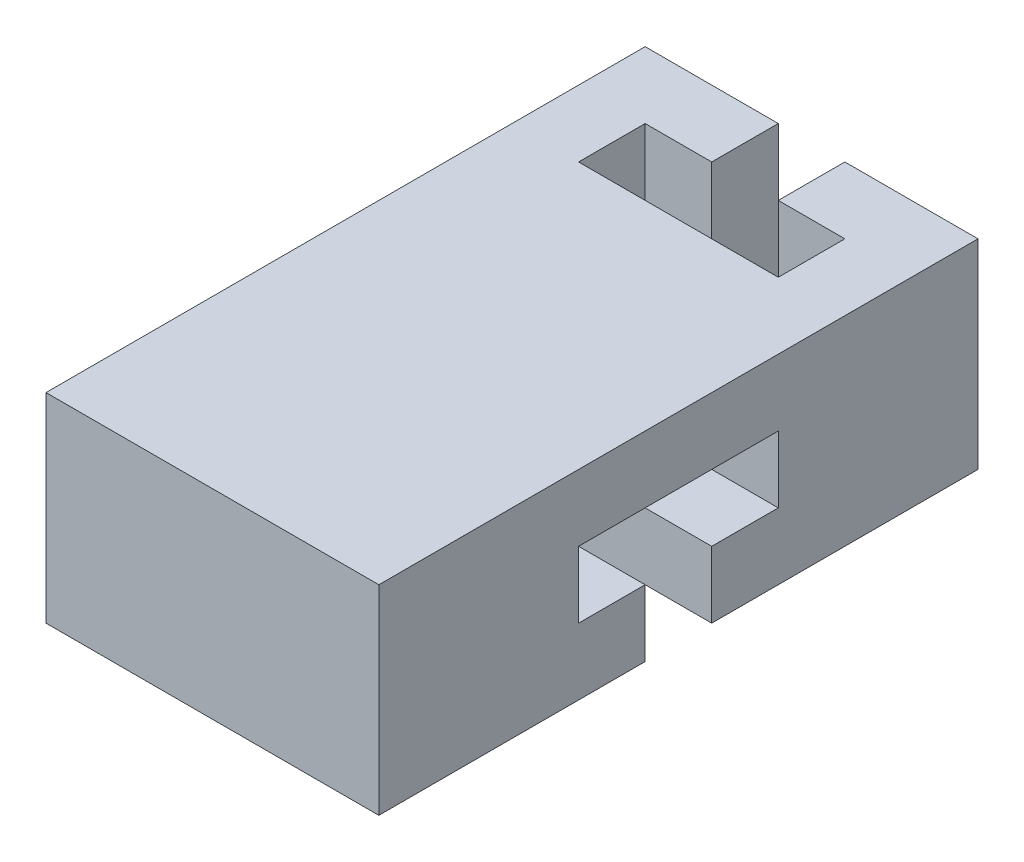
ISO-10303-21;
HEADER;
FILE_DESCRIPTION(('STEP AP214'),'2;1');
FILE_NAME('part.step','',(''),(''),'','','');
FILE_SCHEMA(('AUTOMOTIVE_DESIGN { 1 0 10303 214 1 1 1 1 }'));
ENDSEC;
DATA;
#1=APPLICATION_CONTEXT('core data for automotive mechanical design processes');
#2=APPLICATION_PROTOCOL_DEFINITION('international standard','automotive_design',2000,#1);
#3=PRODUCT_CONTEXT('',#1,'mechanical');
#4=PRODUCT('Part','Part','',(#3));
#5=PRODUCT_RELATED_PRODUCT_CATEGORY('part','',(#4));
#6=PRODUCT_DEFINITION_FORMATION('','',#4);
#7=PRODUCT_DEFINITION_CONTEXT('part definition',#1,'design');
#8=PRODUCT_DEFINITION('design','',#6,#7);
#9=PRODUCT_DEFINITION_SHAPE('','',#8);
#10=(LENGTH_UNIT() NAMED_UNIT(*) SI_UNIT(.MILLI.,.METRE.));
#11=(NAMED_UNIT(*) PLANE_ANGLE_UNIT() SI_UNIT($,.RADIAN.));
#12=(NAMED_UNIT(*) SI_UNIT($,.STERADIAN.) SOLID_ANGLE_UNIT());
#13=UNCERTAINTY_MEASURE_WITH_UNIT(LENGTH_MEASURE(1.E-05),#10,'distance_accuracy_value','');
#14=(GEOMETRIC_REPRESENTATION_CONTEXT(3) GLOBAL_UNCERTAINTY_ASSIGNED_CONTEXT((#13)) GLOBAL_UNIT_ASSIGNED_CONTEXT((#10,
#11,#12)) REPRESENTATION_CONTEXT('',''));
#15=CARTESIAN_POINT('',(0.,0.,0.));
#16=DIRECTION('',(0.,0.,1.));
#17=DIRECTION('',(1.,0.,0.));
#18=AXIS2_PLACEMENT_3D('',#15,#16,#17);
#19=CARTESIAN_POINT('',(-250.,75.,-225.));
#20=DIRECTION('',(0.,0.,-1.));
#21=DIRECTION('',(0.,1.,0.));
#22=AXIS2_PLACEMENT_3D('',#19,#20,#21);
#23=PLANE('',#22);
#24=DIRECTION('',(0.,-1.,0.));
#25=VECTOR('',#24,1.);
#26=CARTESIAN_POINT('',(-100.,75.,-225.));
#27=LINE('',#26,#25);
#28=CARTESIAN_POINT('',(-100.,75.,-225.));
#29=VERTEX_POINT('',#28);
#30=CARTESIAN_POINT('',(-100.,-75.,-225.));
#31=VERTEX_POINT('',#30);
#32=EDGE_CURVE('E11',#29,#31,#27,.T.);
#33=ORIENTED_EDGE('',*,*,#32,.F.);
#34=DIRECTION('',(1.,0.,0.));
#35=VECTOR('',#34,1.);
#36=CARTESIAN_POINT('',(-250.,75.,-225.));
#37=LINE('',#36,#35);
#38=CARTESIAN_POINT('',(0.,75.,-225.));
#39=VERTEX_POINT('',#38);
#40=EDGE_CURVE('E222',#29,#39,#37,.T.);
#41=ORIENTED_EDGE('',*,*,#40,.T.);
#42=DIRECTION('',(0.,1.,0.));
#43=VECTOR('',#42,1.);
#44=CARTESIAN_POINT('',(0.,75.,-225.));
#45=LINE('',#44,#43);
#46=CARTESIAN_POINT('',(0.,-75.,-225.));
#47=VERTEX_POINT('',#46);
#48=EDGE_CURVE('E172',#47,#39,#45,.T.);
#49=ORIENTED_EDGE('',*,*,#48,.F.);
#50=DIRECTION('',(1.,0.,0.));
#51=VECTOR('',#50,1.);
#52=CARTESIAN_POINT('',(-250.,-75.,-225.));
#53=LINE('',#52,#51);
#54=EDGE_CURVE('E168',#31,#47,#53,.T.);
#55=ORIENTED_EDGE('',*,*,#54,.F.);
#56=EDGE_LOOP('',(#33,#41,#49,#55));
#57=FACE_BOUND('',#56,.T.);
#58=ADVANCED_FACE('F32',(#57),#23,.T.);
#59=CARTESIAN_POINT('',(-250.,-75.,-25.));
#60=DIRECTION('',(0.,-1.,0.));
#61=DIRECTION('',(0.,0.,-1.));
#62=AXIS2_PLACEMENT_3D('',#59,#60,#61);
#63=PLANE('',#62);
#64=DIRECTION('',(0.,0.,1.));
#65=VECTOR('',#64,1.);
#66=CARTESIAN_POINT('',(-100.,-75.,-24.9999999999999));
#67=LINE('',#66,#65);
#68=CARTESIAN_POINT('',(-100.,-75.,-175.));
#69=VERTEX_POINT('',#68);
#70=EDGE_CURVE('E301',#31,#69,#67,.T.);
#71=ORIENTED_EDGE('',*,*,#70,.F.);
#72=ORIENTED_EDGE('',*,*,#54,.T.);
#73=DIRECTION('',(0.,0.,-1.));
#74=VECTOR('',#73,1.);
#75=CARTESIAN_POINT('',(0.,-75.,-25.));
#76=LINE('',#75,#74);
#77=CARTESIAN_POINT('',(0.,-75.,-25.));
#78=VERTEX_POINT('',#77);
#79=EDGE_CURVE('E169',#78,#47,#76,.T.);
#80=ORIENTED_EDGE('',*,*,#79,.F.);
#81=DIRECTION('',(1.,0.,0.));
#82=VECTOR('',#81,1.);
#83=CARTESIAN_POINT('',(-250.,-75.,-25.));
#84=LINE('',#83,#82);
#85=CARTESIAN_POINT('',(-250.,-75.,-25.));
#86=VERTEX_POINT('',#85);
#87=EDGE_CURVE('E56',#86,#78,#84,.T.);
#88=ORIENTED_EDGE('',*,*,#87,.F.);
#89=DIRECTION('',(0.,0.,-1.));
#90=VECTOR('',#89,1.);
#91=CARTESIAN_POINT('',(-250.,-75.,-25.));
#92=LINE('',#91,#90);
#93=CARTESIAN_POINT('',(-250.,-75.,-225.));
#94=VERTEX_POINT('',#93);
#95=EDGE_CURVE('E203',#86,#94,#92,.T.);
#96=ORIENTED_EDGE('',*,*,#95,.T.);
#97=CARTESIAN_POINT('',(-150.,-75.,-225.));
#98=VERTEX_POINT('',#97);
#99=EDGE_CURVE('E107',#94,#98,#53,.T.);
#100=ORIENTED_EDGE('',*,*,#99,.T.);
#101=DIRECTION('',(0.,0.,-1.));
#102=VECTOR('',#101,1.);
#103=CARTESIAN_POINT('',(-150.,-75.,-25.));
#104=LINE('',#103,#102);
#105=CARTESIAN_POINT('',(-150.,-75.,-175.));
#106=VERTEX_POINT('',#105);
#107=EDGE_CURVE('E47',#106,#98,#104,.T.);
#108=ORIENTED_EDGE('',*,*,#107,.F.);
#109=DIRECTION('',(1.,0.,0.));
#110=VECTOR('',#109,1.);
#111=CARTESIAN_POINT('',(-250.,-75.,-175.));
#112=LINE('',#111,#110);
#113=CARTESIAN_POINT('',(-200.,-75.,-175.));
#114=VERTEX_POINT('',#113);
#115=EDGE_CURVE('E309',#114,#106,#112,.T.);
#116=ORIENTED_EDGE('',*,*,#115,.F.);
#117=DIRECTION('',(0.,0.,-1.));
#118=VECTOR('',#117,1.);
#119=CARTESIAN_POINT('',(-200.,-75.,-25.));
#120=LINE('',#119,#118);
#121=CARTESIAN_POINT('',(-200.,-75.,-125.));
#122=VERTEX_POINT('',#121);
#123=EDGE_CURVE('E312',#122,#114,#120,.T.);
#124=ORIENTED_EDGE('',*,*,#123,.F.);
#125=DIRECTION('',(-1.,0.,0.));
#126=VECTOR('',#125,1.);
#127=CARTESIAN_POINT('',(-250.,-75.,-125.));
#128=LINE('',#127,#126);
#129=CARTESIAN_POINT('',(-50.,-75.,-125.));
#130=VERTEX_POINT('',#129);
#131=EDGE_CURVE('E320',#130,#122,#128,.T.);
#132=ORIENTED_EDGE('',*,*,#131,.F.);
#133=DIRECTION('',(0.,0.,1.));
#134=VECTOR('',#133,1.);
#135=CARTESIAN_POINT('',(-50.,-75.,-25.));
#136=LINE('',#135,#134);
#137=CARTESIAN_POINT('',(-50.,-75.,-175.));
#138=VERTEX_POINT('',#137);
#139=EDGE_CURVE('E323',#138,#130,#136,.T.);
#140=ORIENTED_EDGE('',*,*,#139,.F.);
#141=DIRECTION('',(1.,0.,0.));
#142=VECTOR('',#141,1.);
#143=CARTESIAN_POINT('',(-250.,-75.,-175.));
#144=LINE('',#143,#142);
#145=EDGE_CURVE('E173',#69,#138,#144,.T.);
#146=ORIENTED_EDGE('',*,*,#145,.F.);
#147=EDGE_LOOP('',(#71,#72,#80,#88,#96,#100,#108,#116,#124,#132,#140,#146));
#148=FACE_BOUND('',#147,.T.);
#149=ADVANCED_FACE('F34',(#148),#63,.T.);
#150=CARTESIAN_POINT('',(-250.,-25.,-25.));
#151=DIRECTION('',(0.,0.,1.));
#152=DIRECTION('',(0.,-1.,0.));
#153=AXIS2_PLACEMENT_3D('',#150,#151,#152);
#154=PLANE('',#153);
#155=DIRECTION('',(0.,-1.,0.));
#156=VECTOR('',#155,1.);
#157=CARTESIAN_POINT('',(0.,-25.,-25.));
#158=LINE('',#157,#156);
#159=CARTESIAN_POINT('',(0.,-25.,-25.));
#160=VERTEX_POINT('',#159);
#161=EDGE_CURVE('E200',#160,#78,#158,.T.);
#162=ORIENTED_EDGE('',*,*,#161,.F.);
#163=DIRECTION('',(1.,0.,0.));
#164=VECTOR('',#163,1.);
#165=CARTESIAN_POINT('',(-250.,-25.,-25.));
#166=LINE('',#165,#164);
#167=CARTESIAN_POINT('',(-250.,-25.,-25.));
#168=VERTEX_POINT('',#167);
#169=EDGE_CURVE('E149',#168,#160,#166,.T.);
#170=ORIENTED_EDGE('',*,*,#169,.F.);
#171=DIRECTION('',(0.,-1.,0.));
#172=VECTOR('',#171,1.);
#173=CARTESIAN_POINT('',(-250.,-25.,-25.));
#174=LINE('',#173,#172);
#175=EDGE_CURVE('E158',#168,#86,#174,.T.);
#176=ORIENTED_EDGE('',*,*,#175,.T.);
#177=ORIENTED_EDGE('',*,*,#87,.T.);
#178=EDGE_LOOP('',(#162,#170,#176,#177));
#179=FACE_BOUND('',#178,.T.);
#180=ADVANCED_FACE('F383',(#179),#154,.T.);
#181=CARTESIAN_POINT('',(-250.,-25.,-75.));
#182=DIRECTION('',(0.,1.,0.));
#183=DIRECTION('',(0.,0.,1.));
#184=AXIS2_PLACEMENT_3D('',#181,#182,#183);
#185=PLANE('',#184);
#186=DIRECTION('',(0.,0.,1.));
#187=VECTOR('',#186,1.);
#188=CARTESIAN_POINT('',(0.,-25.,-75.));
#189=LINE('',#188,#187);
#190=CARTESIAN_POINT('',(0.,-25.,-75.));
#191=VERTEX_POINT('',#190);
#192=EDGE_CURVE('E144',#191,#160,#189,.T.);
#193=ORIENTED_EDGE('',*,*,#192,.F.);
#194=DIRECTION('',(1.,0.,0.));
#195=VECTOR('',#194,1.);
#196=CARTESIAN_POINT('',(-250.,-25.,-75.));
#197=LINE('',#196,#195);
#198=CARTESIAN_POINT('',(-250.,-25.,-75.));
#199=VERTEX_POINT('',#198);
#200=EDGE_CURVE('E138',#199,#191,#197,.T.);
#201=ORIENTED_EDGE('',*,*,#200,.F.);
#202=DIRECTION('',(0.,0.,1.));
#203=VECTOR('',#202,1.);
#204=CARTESIAN_POINT('',(-250.,-25.,-75.));
#205=LINE('',#204,#203);
#206=EDGE_CURVE('E141',#199,#168,#205,.T.);
#207=ORIENTED_EDGE('',*,*,#206,.T.);
#208=ORIENTED_EDGE('',*,*,#169,.T.);
#209=EDGE_LOOP('',(#193,#201,#207,#208));
#210=FACE_BOUND('',#209,.T.);
#211=ADVANCED_FACE('F140',(#210),#185,.T.);
#212=CARTESIAN_POINT('',(-250.,25.,-75.));
#213=DIRECTION('',(0.,0.,1.));
#214=DIRECTION('',(0.,-1.,0.));
#215=AXIS2_PLACEMENT_3D('',#212,#213,#214);
#216=PLANE('',#215);
#217=DIRECTION('',(0.,-1.,0.));
#218=VECTOR('',#217,1.);
#219=CARTESIAN_POINT('',(0.,25.,-75.));
#220=LINE('',#219,#218);
#221=CARTESIAN_POINT('',(0.,25.,-75.));
#222=VERTEX_POINT('',#221);
#223=EDGE_CURVE('E197',#222,#191,#220,.T.);
#224=ORIENTED_EDGE('',*,*,#223,.F.);
#225=DIRECTION('',(1.,0.,0.));
#226=VECTOR('',#225,1.);
#227=CARTESIAN_POINT('',(-250.,25.,-75.));
#228=LINE('',#227,#226);
#229=CARTESIAN_POINT('',(-250.,25.,-75.));
#230=VERTEX_POINT('',#229);
#231=EDGE_CURVE('E150',#230,#222,#228,.T.);
#232=ORIENTED_EDGE('',*,*,#231,.F.);
#233=DIRECTION('',(0.,-1.,0.));
#234=VECTOR('',#233,1.);
#235=CARTESIAN_POINT('',(-250.,25.,-75.));
#236=LINE('',#235,#234);
#237=EDGE_CURVE('E156',#230,#199,#236,.T.);
#238=ORIENTED_EDGE('',*,*,#237,.T.);
#239=ORIENTED_EDGE('',*,*,#200,.T.);
#240=EDGE_LOOP('',(#224,#232,#238,#239));
#241=FACE_BOUND('',#240,.T.);
#242=ADVANCED_FACE('F160',(#241),#216,.T.);
#243=CARTESIAN_POINT('',(-250.,25.,75.));
#244=DIRECTION('',(0.,-1.,0.));
#245=DIRECTION('',(0.,0.,-1.));
#246=AXIS2_PLACEMENT_3D('',#243,#244,#245);
#247=PLANE('',#246);
#248=DIRECTION('',(0.,0.,-1.));
#249=VECTOR('',#248,1.);
#250=CARTESIAN_POINT('',(0.,25.,75.));
#251=LINE('',#250,#249);
#252=CARTESIAN_POINT('',(0.,25.,75.));
#253=VERTEX_POINT('',#252);
#254=EDGE_CURVE('E194',#253,#222,#251,.T.);
#255=ORIENTED_EDGE('',*,*,#254,.F.);
#256=DIRECTION('',(1.,0.,0.));
#257=VECTOR('',#256,1.);
#258=CARTESIAN_POINT('',(-250.,25.,75.));
#259=LINE('',#258,#257);
#260=CARTESIAN_POINT('',(-250.,25.,75.));
#261=VERTEX_POINT('',#260);
#262=EDGE_CURVE('E207',#261,#253,#259,.T.);
#263=ORIENTED_EDGE('',*,*,#262,.F.);
#264=DIRECTION('',(0.,0.,-1.));
#265=VECTOR('',#264,1.);
#266=CARTESIAN_POINT('',(-250.,25.,75.));
#267=LINE('',#266,#265);
#268=EDGE_CURVE('E161',#261,#230,#267,.T.);
#269=ORIENTED_EDGE('',*,*,#268,.T.);
#270=ORIENTED_EDGE('',*,*,#231,.T.);
#271=EDGE_LOOP('',(#255,#263,#269,#270));
#272=FACE_BOUND('',#271,.T.);
#273=ADVANCED_FACE('F385',(#272),#247,.T.);
#274=CARTESIAN_POINT('',(-250.,-25.,75.));
#275=DIRECTION('',(0.,0.,-1.));
#276=DIRECTION('',(-1.,0.,0.));
#277=AXIS2_PLACEMENT_3D('',#274,#275,#276);
#278=PLANE('',#277);
#279=DIRECTION('',(0.,1.,0.));
#280=VECTOR('',#279,1.);
#281=CARTESIAN_POINT('',(0.,-25.,75.));
#282=LINE('',#281,#280);
#283=CARTESIAN_POINT('',(0.,-25.,75.));
#284=VERTEX_POINT('',#283);
#285=EDGE_CURVE('E191',#284,#253,#282,.T.);
#286=ORIENTED_EDGE('',*,*,#285,.F.);
#287=DIRECTION('',(1.,0.,0.));
#288=VECTOR('',#287,1.);
#289=CARTESIAN_POINT('',(-250.,-25.,75.));
#290=LINE('',#289,#288);
#291=CARTESIAN_POINT('',(-250.,-25.,75.));
#292=VERTEX_POINT('',#291);
#293=EDGE_CURVE('E209',#292,#284,#290,.T.);
#294=ORIENTED_EDGE('',*,*,#293,.F.);
#295=DIRECTION('',(0.,1.,0.));
#296=VECTOR('',#295,1.);
#297=CARTESIAN_POINT('',(-250.,-25.,75.));
#298=LINE('',#297,#296);
#299=EDGE_CURVE('E163',#292,#261,#298,.T.);
#300=ORIENTED_EDGE('',*,*,#299,.T.);
#301=ORIENTED_EDGE('',*,*,#262,.T.);
#302=EDGE_LOOP('',(#286,#294,#300,#301));
#303=FACE_BOUND('',#302,.T.);
#304=ADVANCED_FACE('F263',(#303),#278,.T.);
#305=CARTESIAN_POINT('',(-250.,-25.,25.));
#306=DIRECTION('',(0.,1.,0.));
#307=DIRECTION('',(0.,0.,1.));
#308=AXIS2_PLACEMENT_3D('',#305,#306,#307);
#309=PLANE('',#308);
#310=DIRECTION('',(0.,0.,1.));
#311=VECTOR('',#310,1.);
#312=CARTESIAN_POINT('',(0.,-25.,25.));
#313=LINE('',#312,#311);
#314=CARTESIAN_POINT('',(0.,-25.,25.));
#315=VERTEX_POINT('',#314);
#316=EDGE_CURVE('E188',#315,#284,#313,.T.);
#317=ORIENTED_EDGE('',*,*,#316,.F.);
#318=DIRECTION('',(1.,0.,0.));
#319=VECTOR('',#318,1.);
#320=CARTESIAN_POINT('',(-250.,-25.,25.));
#321=LINE('',#320,#319);
#322=CARTESIAN_POINT('',(-250.,-25.,25.));
#323=VERTEX_POINT('',#322);
#324=EDGE_CURVE('E211',#323,#315,#321,.T.);
#325=ORIENTED_EDGE('',*,*,#324,.F.);
#326=DIRECTION('',(0.,0.,1.));
#327=VECTOR('',#326,1.);
#328=CARTESIAN_POINT('',(-250.,-25.,25.));
#329=LINE('',#328,#327);
#330=EDGE_CURVE('E257',#323,#292,#329,.T.);
#331=ORIENTED_EDGE('',*,*,#330,.T.);
#332=ORIENTED_EDGE('',*,*,#293,.T.);
#333=EDGE_LOOP('',(#317,#325,#331,#332));
#334=FACE_BOUND('',#333,.T.);
#335=ADVANCED_FACE('F269',(#334),#309,.T.);
#336=CARTESIAN_POINT('',(-250.,-75.,25.));
#337=DIRECTION('',(0.,0.,-1.));
#338=DIRECTION('',(0.,1.,0.));
#339=AXIS2_PLACEMENT_3D('',#336,#337,#338);
#340=PLANE('',#339);
#341=DIRECTION('',(0.,1.,0.));
#342=VECTOR('',#341,1.);
#343=CARTESIAN_POINT('',(0.,-75.,25.));
#344=LINE('',#343,#342);
#345=CARTESIAN_POINT('',(0.,-75.,25.));
#346=VERTEX_POINT('',#345);
#347=EDGE_CURVE('E185',#346,#315,#344,.T.);
#348=ORIENTED_EDGE('',*,*,#347,.F.);
#349=DIRECTION('',(1.,0.,0.));
#350=VECTOR('',#349,1.);
#351=CARTESIAN_POINT('',(-250.,-75.,25.));
#352=LINE('',#351,#350);
#353=CARTESIAN_POINT('',(-250.,-75.,25.));
#354=VERTEX_POINT('',#353);
#355=EDGE_CURVE('E213',#354,#346,#352,.T.);
#356=ORIENTED_EDGE('',*,*,#355,.F.);
#357=DIRECTION('',(0.,1.,0.));
#358=VECTOR('',#357,1.);
#359=CARTESIAN_POINT('',(-250.,-75.,25.));
#360=LINE('',#359,#358);
#361=EDGE_CURVE('E254',#354,#323,#360,.T.);
#362=ORIENTED_EDGE('',*,*,#361,.T.);
#363=ORIENTED_EDGE('',*,*,#324,.T.);
#364=EDGE_LOOP('',(#348,#356,#362,#363));
#365=FACE_BOUND('',#364,.T.);
#366=ADVANCED_FACE('F272',(#365),#340,.T.);
#367=CARTESIAN_POINT('',(-250.,-75.,225.));
#368=DIRECTION('',(0.,-1.,0.));
#369=DIRECTION('',(0.,0.,-1.));
#370=AXIS2_PLACEMENT_3D('',#367,#368,#369);
#371=PLANE('',#370);
#372=DIRECTION('',(0.,0.,-1.));
#373=VECTOR('',#372,1.);
#374=CARTESIAN_POINT('',(0.,-75.,225.));
#375=LINE('',#374,#373);
#376=CARTESIAN_POINT('',(0.,-75.,225.));
#377=VERTEX_POINT('',#376);
#378=EDGE_CURVE('E182',#377,#346,#375,.T.);
#379=ORIENTED_EDGE('',*,*,#378,.F.);
#380=DIRECTION('',(1.,0.,0.));
#381=VECTOR('',#380,1.);
#382=CARTESIAN_POINT('',(-250.,-75.,225.));
#383=LINE('',#382,#381);
#384=CARTESIAN_POINT('',(-250.,-75.,225.));
#385=VERTEX_POINT('',#384);
#386=EDGE_CURVE('E215',#385,#377,#383,.T.);
#387=ORIENTED_EDGE('',*,*,#386,.F.);
#388=DIRECTION('',(0.,0.,-1.));
#389=VECTOR('',#388,1.);
#390=CARTESIAN_POINT('',(-250.,-75.,225.));
#391=LINE('',#390,#389);
#392=EDGE_CURVE('E251',#385,#354,#391,.T.);
#393=ORIENTED_EDGE('',*,*,#392,.T.);
#394=ORIENTED_EDGE('',*,*,#355,.T.);
#395=EDGE_LOOP('',(#379,#387,#393,#394));
#396=FACE_BOUND('',#395,.T.);
#397=ADVANCED_FACE('F277',(#396),#371,.T.);
#398=CARTESIAN_POINT('',(-250.,75.,225.));
#399=DIRECTION('',(0.,0.,1.));
#400=DIRECTION('',(1.,0.,0.));
#401=AXIS2_PLACEMENT_3D('',#398,#399,#400);
#402=PLANE('',#401);
#403=DIRECTION('',(0.,-1.,0.));
#404=VECTOR('',#403,1.);
#405=CARTESIAN_POINT('',(0.,75.,225.));
#406=LINE('',#405,#404);
#407=CARTESIAN_POINT('',(0.,75.,225.));
#408=VERTEX_POINT('',#407);
#409=EDGE_CURVE('E179',#408,#377,#406,.T.);
#410=ORIENTED_EDGE('',*,*,#409,.F.);
#411=DIRECTION('',(1.,0.,0.));
#412=VECTOR('',#411,1.);
#413=CARTESIAN_POINT('',(-250.,75.,225.));
#414=LINE('',#413,#412);
#415=CARTESIAN_POINT('',(-250.,75.,225.));
#416=VERTEX_POINT('',#415);
#417=EDGE_CURVE('E217',#416,#408,#414,.T.);
#418=ORIENTED_EDGE('',*,*,#417,.F.);
#419=DIRECTION('',(0.,-1.,0.));
#420=VECTOR('',#419,1.);
#421=CARTESIAN_POINT('',(-250.,75.,225.));
#422=LINE('',#421,#420);
#423=EDGE_CURVE('E244',#416,#385,#422,.T.);
#424=ORIENTED_EDGE('',*,*,#423,.T.);
#425=ORIENTED_EDGE('',*,*,#386,.T.);
#426=EDGE_LOOP('',(#410,#418,#424,#425));
#427=FACE_BOUND('',#426,.T.);
#428=ADVANCED_FACE('F280',(#427),#402,.T.);
#429=CARTESIAN_POINT('',(-250.,75.,225.));
#430=DIRECTION('',(0.,1.,0.));
#431=DIRECTION('',(0.,0.,1.));
#432=AXIS2_PLACEMENT_3D('',#429,#430,#431);
#433=PLANE('',#432);
#434=DIRECTION('',(0.,0.,-1.));
#435=VECTOR('',#434,1.);
#436=CARTESIAN_POINT('',(-100.,75.,-225.));
#437=LINE('',#436,#435);
#438=CARTESIAN_POINT('',(-100.,75.,-175.));
#439=VERTEX_POINT('',#438);
#440=EDGE_CURVE('E303',#439,#29,#437,.T.);
#441=ORIENTED_EDGE('',*,*,#440,.F.);
#442=DIRECTION('',(-1.,0.,0.));
#443=VECTOR('',#442,1.);
#444=CARTESIAN_POINT('',(-100.,75.,-175.));
#445=LINE('',#444,#443);
#446=CARTESIAN_POINT('',(-50.,75.,-175.));
#447=VERTEX_POINT('',#446);
#448=EDGE_CURVE('E369',#447,#439,#445,.T.);
#449=ORIENTED_EDGE('',*,*,#448,.F.);
#450=DIRECTION('',(0.,0.,-1.));
#451=VECTOR('',#450,1.);
#452=CARTESIAN_POINT('',(-50.,75.,-175.));
#453=LINE('',#452,#451);
#454=CARTESIAN_POINT('',(-50.,75.,-125.));
#455=VERTEX_POINT('',#454);
#456=EDGE_CURVE('E339',#455,#447,#453,.T.);
#457=ORIENTED_EDGE('',*,*,#456,.F.);
#458=DIRECTION('',(1.,0.,0.));
#459=VECTOR('',#458,1.);
#460=CARTESIAN_POINT('',(-50.,75.,-125.));
#461=LINE('',#460,#459);
#462=CARTESIAN_POINT('',(-200.,75.,-125.));
#463=VERTEX_POINT('',#462);
#464=EDGE_CURVE('E563',#463,#455,#461,.T.);
#465=ORIENTED_EDGE('',*,*,#464,.F.);
#466=DIRECTION('',(0.,0.,1.));
#467=VECTOR('',#466,1.);
#468=CARTESIAN_POINT('',(-200.,75.,-125.));
#469=LINE('',#468,#467);
#470=CARTESIAN_POINT('',(-200.,75.,-175.));
#471=VERTEX_POINT('',#470);
#472=EDGE_CURVE('E360',#471,#463,#469,.T.);
#473=ORIENTED_EDGE('',*,*,#472,.F.);
#474=DIRECTION('',(-1.,0.,0.));
#475=VECTOR('',#474,1.);
#476=CARTESIAN_POINT('',(-200.,75.,-175.));
#477=LINE('',#476,#475);
#478=CARTESIAN_POINT('',(-150.,75.,-175.));
#479=VERTEX_POINT('',#478);
#480=EDGE_CURVE('E238',#479,#471,#477,.T.);
#481=ORIENTED_EDGE('',*,*,#480,.F.);
#482=DIRECTION('',(0.,0.,1.));
#483=VECTOR('',#482,1.);
#484=CARTESIAN_POINT('',(-150.,75.,-175.));
#485=LINE('',#484,#483);
#486=CARTESIAN_POINT('',(-150.,75.,-225.));
#487=VERTEX_POINT('',#486);
#488=EDGE_CURVE('E228',#487,#479,#485,.T.);
#489=ORIENTED_EDGE('',*,*,#488,.F.);
#490=CARTESIAN_POINT('',(-250.,75.,-225.));
#491=VERTEX_POINT('',#490);
#492=EDGE_CURVE('E219',#491,#487,#37,.T.);
#493=ORIENTED_EDGE('',*,*,#492,.F.);
#494=DIRECTION('',(0.,0.,1.));
#495=VECTOR('',#494,1.);
#496=CARTESIAN_POINT('',(-250.,75.,225.));
#497=LINE('',#496,#495);
#498=EDGE_CURVE('E242',#491,#416,#497,.T.);
#499=ORIENTED_EDGE('',*,*,#498,.T.);
#500=ORIENTED_EDGE('',*,*,#417,.T.);
#501=DIRECTION('',(0.,0.,1.));
#502=VECTOR('',#501,1.);
#503=CARTESIAN_POINT('',(0.,75.,225.));
#504=LINE('',#503,#502);
#505=EDGE_CURVE('E176',#39,#408,#504,.T.);
#506=ORIENTED_EDGE('',*,*,#505,.F.);
#507=ORIENTED_EDGE('',*,*,#40,.F.);
#508=EDGE_LOOP('',(#441,#449,#457,#465,#473,#481,#489,#493,#499,#500,#506,#507));
#509=FACE_BOUND('',#508,.T.);
#510=ADVANCED_FACE('F233',(#509),#433,.T.);
#511=DIRECTION('',(0.,1.,0.));
#512=VECTOR('',#511,1.);
#513=CARTESIAN_POINT('',(-150.,75.,-225.));
#514=LINE('',#513,#512);
#515=EDGE_CURVE('E40',#98,#487,#514,.T.);
#516=ORIENTED_EDGE('',*,*,#515,.F.);
#517=ORIENTED_EDGE('',*,*,#99,.F.);
#518=DIRECTION('',(0.,1.,0.));
#519=VECTOR('',#518,1.);
#520=CARTESIAN_POINT('',(-250.,75.,-225.));
#521=LINE('',#520,#519);
#522=EDGE_CURVE('E241',#94,#491,#521,.T.);
#523=ORIENTED_EDGE('',*,*,#522,.T.);
#524=ORIENTED_EDGE('',*,*,#492,.T.);
#525=EDGE_LOOP('',(#516,#517,#523,#524));
#526=FACE_BOUND('',#525,.T.);
#527=ADVANCED_FACE('F240',(#526),#23,.T.);
#528=CARTESIAN_POINT('',(-250.,0.,0.));
#529=DIRECTION('',(-1.,0.,0.));
#530=DIRECTION('',(0.,0.,1.));
#531=AXIS2_PLACEMENT_3D('',#528,#529,#530);
#532=PLANE('',#531);
#533=ORIENTED_EDGE('',*,*,#95,.F.);
#534=ORIENTED_EDGE('',*,*,#175,.F.);
#535=ORIENTED_EDGE('',*,*,#206,.F.);
#536=ORIENTED_EDGE('',*,*,#237,.F.);
#537=ORIENTED_EDGE('',*,*,#268,.F.);
#538=ORIENTED_EDGE('',*,*,#299,.F.);
#539=ORIENTED_EDGE('',*,*,#330,.F.);
#540=ORIENTED_EDGE('',*,*,#361,.F.);
#541=ORIENTED_EDGE('',*,*,#392,.F.);
#542=ORIENTED_EDGE('',*,*,#423,.F.);
#543=ORIENTED_EDGE('',*,*,#498,.F.);
#544=ORIENTED_EDGE('',*,*,#522,.F.);
#545=EDGE_LOOP('',(#533,#534,#535,#536,#537,#538,#539,#540,#541,#542,#543,#544));
#546=FACE_BOUND('',#545,.T.);
#547=ADVANCED_FACE('F154',(#546),#532,.T.);
#548=CARTESIAN_POINT('',(0.,0.,0.));
#549=DIRECTION('',(-1.,0.,0.));
#550=DIRECTION('',(0.,0.,1.));
#551=AXIS2_PLACEMENT_3D('',#548,#549,#550);
#552=PLANE('',#551);
#553=ORIENTED_EDGE('',*,*,#79,.T.);
#554=ORIENTED_EDGE('',*,*,#48,.T.);
#555=ORIENTED_EDGE('',*,*,#505,.T.);
#556=ORIENTED_EDGE('',*,*,#409,.T.);
#557=ORIENTED_EDGE('',*,*,#378,.T.);
#558=ORIENTED_EDGE('',*,*,#347,.T.);
#559=ORIENTED_EDGE('',*,*,#316,.T.);
#560=ORIENTED_EDGE('',*,*,#285,.T.);
#561=ORIENTED_EDGE('',*,*,#254,.T.);
#562=ORIENTED_EDGE('',*,*,#223,.T.);
#563=ORIENTED_EDGE('',*,*,#192,.T.);
#564=ORIENTED_EDGE('',*,*,#161,.T.);
#565=EDGE_LOOP('',(#553,#554,#555,#556,#557,#558,#559,#560,#561,#562,#563,#564));
#566=FACE_BOUND('',#565,.T.);
#567=ADVANCED_FACE('F286',(#566),#552,.F.);
#568=CARTESIAN_POINT('',(-100.,-175.,-225.));
#569=DIRECTION('',(1.,0.,0.));
#570=DIRECTION('',(0.,0.,-1.));
#571=AXIS2_PLACEMENT_3D('',#568,#569,#570);
#572=PLANE('',#571);
#573=ORIENTED_EDGE('',*,*,#70,.T.);
#574=DIRECTION('',(0.,1.,0.));
#575=VECTOR('',#574,1.);
#576=CARTESIAN_POINT('',(-100.,-175.,-175.));
#577=LINE('',#576,#575);
#578=EDGE_CURVE('E314',#69,#439,#577,.T.);
#579=ORIENTED_EDGE('',*,*,#578,.T.);
#580=ORIENTED_EDGE('',*,*,#440,.T.);
#581=ORIENTED_EDGE('',*,*,#32,.T.);
#582=EDGE_LOOP('',(#573,#579,#580,#581));
#583=FACE_BOUND('',#582,.T.);
#584=ADVANCED_FACE('F298',(#583),#572,.F.);
#585=CARTESIAN_POINT('',(-100.,-175.,-175.));
#586=DIRECTION('',(0.,0.,-1.));
#587=DIRECTION('',(-1.,0.,0.));
#588=AXIS2_PLACEMENT_3D('',#585,#586,#587);
#589=PLANE('',#588);
#590=ORIENTED_EDGE('',*,*,#145,.T.);
#591=DIRECTION('',(0.,1.,0.));
#592=VECTOR('',#591,1.);
#593=CARTESIAN_POINT('',(-50.,-175.,-175.));
#594=LINE('',#593,#592);
#595=EDGE_CURVE('E331',#138,#447,#594,.T.);
#596=ORIENTED_EDGE('',*,*,#595,.T.);
#597=ORIENTED_EDGE('',*,*,#448,.T.);
#598=ORIENTED_EDGE('',*,*,#578,.F.);
#599=EDGE_LOOP('',(#590,#596,#597,#598));
#600=FACE_BOUND('',#599,.T.);
#601=ADVANCED_FACE('F328',(#600),#589,.F.);
#602=CARTESIAN_POINT('',(-50.,-175.,-175.));
#603=DIRECTION('',(1.,0.,0.));
#604=DIRECTION('',(0.,0.,-1.));
#605=AXIS2_PLACEMENT_3D('',#602,#603,#604);
#606=PLANE('',#605);
#607=ORIENTED_EDGE('',*,*,#139,.T.);
#608=DIRECTION('',(0.,1.,0.));
#609=VECTOR('',#608,1.);
#610=CARTESIAN_POINT('',(-50.,-175.,-125.));
#611=LINE('',#610,#609);
#612=EDGE_CURVE('E341',#130,#455,#611,.T.);
#613=ORIENTED_EDGE('',*,*,#612,.T.);
#614=ORIENTED_EDGE('',*,*,#456,.T.);
#615=ORIENTED_EDGE('',*,*,#595,.F.);
#616=EDGE_LOOP('',(#607,#613,#614,#615));
#617=FACE_BOUND('',#616,.T.);
#618=ADVANCED_FACE('F335',(#617),#606,.F.);
#619=CARTESIAN_POINT('',(-50.,-175.,-125.));
#620=DIRECTION('',(0.,0.,1.));
#621=DIRECTION('',(1.,0.,0.));
#622=AXIS2_PLACEMENT_3D('',#619,#620,#621);
#623=PLANE('',#622);
#624=ORIENTED_EDGE('',*,*,#131,.T.);
#625=DIRECTION('',(0.,1.,0.));
#626=VECTOR('',#625,1.);
#627=CARTESIAN_POINT('',(-200.,-175.,-125.));
#628=LINE('',#627,#626);
#629=EDGE_CURVE('E353',#122,#463,#628,.T.);
#630=ORIENTED_EDGE('',*,*,#629,.T.);
#631=ORIENTED_EDGE('',*,*,#464,.T.);
#632=ORIENTED_EDGE('',*,*,#612,.F.);
#633=EDGE_LOOP('',(#624,#630,#631,#632));
#634=FACE_BOUND('',#633,.T.);
#635=ADVANCED_FACE('F350',(#634),#623,.F.);
#636=CARTESIAN_POINT('',(-200.,-175.,-125.));
#637=DIRECTION('',(-1.,0.,0.));
#638=DIRECTION('',(0.,0.,1.));
#639=AXIS2_PLACEMENT_3D('',#636,#637,#638);
#640=PLANE('',#639);
#641=ORIENTED_EDGE('',*,*,#123,.T.);
#642=DIRECTION('',(0.,1.,0.));
#643=VECTOR('',#642,1.);
#644=CARTESIAN_POINT('',(-200.,-175.,-175.));
#645=LINE('',#644,#643);
#646=EDGE_CURVE('E362',#114,#471,#645,.T.);
#647=ORIENTED_EDGE('',*,*,#646,.T.);
#648=ORIENTED_EDGE('',*,*,#472,.T.);
#649=ORIENTED_EDGE('',*,*,#629,.F.);
#650=EDGE_LOOP('',(#641,#647,#648,#649));
#651=FACE_BOUND('',#650,.T.);
#652=ADVANCED_FACE('F357',(#651),#640,.F.);
#653=CARTESIAN_POINT('',(-200.,-175.,-175.));
#654=DIRECTION('',(0.,0.,-1.));
#655=DIRECTION('',(-1.,0.,0.));
#656=AXIS2_PLACEMENT_3D('',#653,#654,#655);
#657=PLANE('',#656);
#658=ORIENTED_EDGE('',*,*,#115,.T.);
#659=DIRECTION('',(0.,1.,0.));
#660=VECTOR('',#659,1.);
#661=CARTESIAN_POINT('',(-150.,-175.,-175.));
#662=LINE('',#661,#660);
#663=EDGE_CURVE('E365',#106,#479,#662,.T.);
#664=ORIENTED_EDGE('',*,*,#663,.T.);
#665=ORIENTED_EDGE('',*,*,#480,.T.);
#666=ORIENTED_EDGE('',*,*,#646,.F.);
#667=EDGE_LOOP('',(#658,#664,#665,#666));
#668=FACE_BOUND('',#667,.T.);
#669=ADVANCED_FACE('F382',(#668),#657,.F.);
#670=CARTESIAN_POINT('',(-150.,-175.,-175.));
#671=DIRECTION('',(-1.,0.,0.));
#672=DIRECTION('',(0.,0.,1.));
#673=AXIS2_PLACEMENT_3D('',#670,#671,#672);
#674=PLANE('',#673);
#675=ORIENTED_EDGE('',*,*,#107,.T.);
#676=ORIENTED_EDGE('',*,*,#515,.T.);
#677=ORIENTED_EDGE('',*,*,#488,.T.);
#678=ORIENTED_EDGE('',*,*,#663,.F.);
#679=EDGE_LOOP('',(#675,#676,#677,#678));
#680=FACE_BOUND('',#679,.T.);
#681=ADVANCED_FACE('F226',(#680),#674,.F.);
#682=CLOSED_SHELL('',(#58,#149,#180,#211,#242,#273,#304,#335,#366,#397,#428,#510,#527,#547,#567,
#584,#601,#618,#635,#652,#669,#681));
#683=MANIFOLD_SOLID_BREP('B2',#682);
#684=ADVANCED_BREP_SHAPE_REPRESENTATION('',(#18,#683),#14);
#685=SHAPE_DEFINITION_REPRESENTATION(#9,#684);
ENDSEC;
END-ISO-10303-21;
